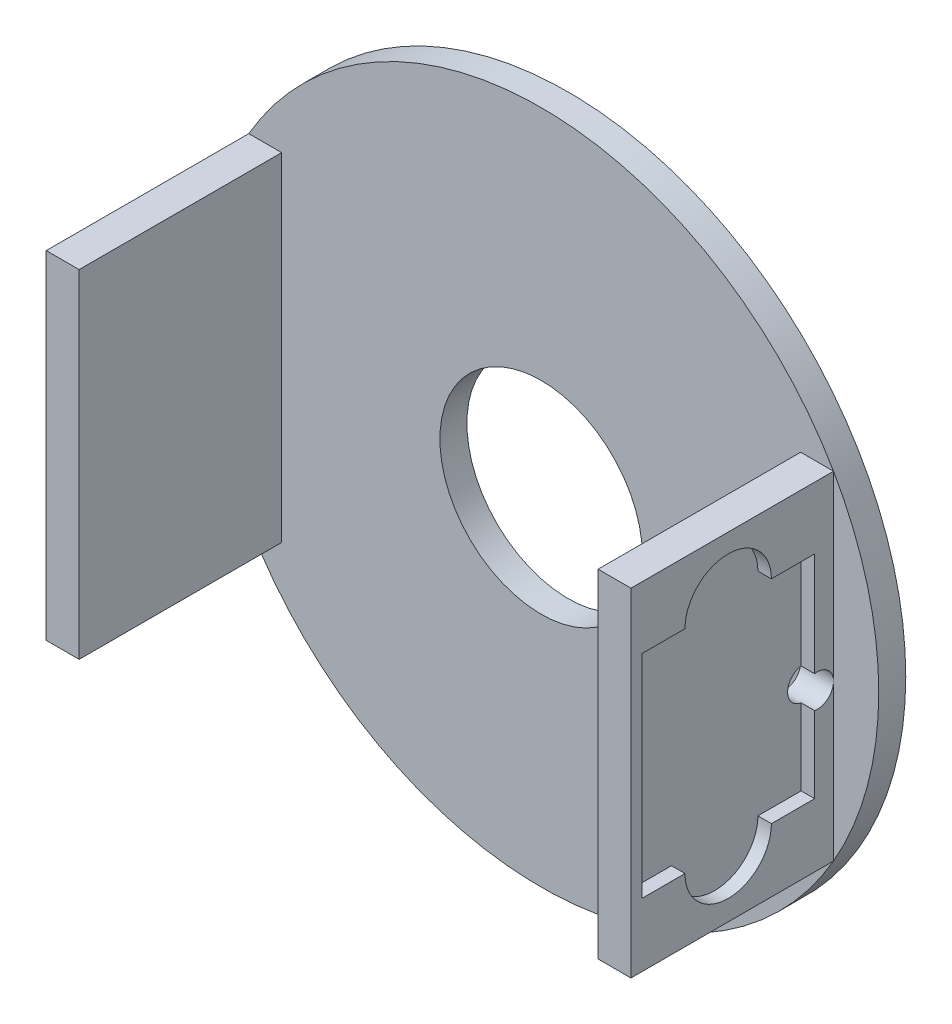
ISO-10303-21;
HEADER;
FILE_DESCRIPTION(('STEP AP214'),'2;1');
FILE_NAME('part.step','',(''),(''),'','','');
FILE_SCHEMA(('AUTOMOTIVE_DESIGN { 1 0 10303 214 1 1 1 1 }'));
ENDSEC;
DATA;
#1=APPLICATION_CONTEXT('core data for automotive mechanical design processes');
#2=APPLICATION_PROTOCOL_DEFINITION('international standard','automotive_design',2000,#1);
#3=PRODUCT_CONTEXT('',#1,'mechanical');
#4=PRODUCT('Part','Part','',(#3));
#5=PRODUCT_RELATED_PRODUCT_CATEGORY('part','',(#4));
#6=PRODUCT_DEFINITION_FORMATION('','',#4);
#7=PRODUCT_DEFINITION_CONTEXT('part definition',#1,'design');
#8=PRODUCT_DEFINITION('design','',#6,#7);
#9=PRODUCT_DEFINITION_SHAPE('','',#8);
#10=(LENGTH_UNIT() NAMED_UNIT(*) SI_UNIT(.MILLI.,.METRE.));
#11=(NAMED_UNIT(*) PLANE_ANGLE_UNIT() SI_UNIT($,.RADIAN.));
#12=(NAMED_UNIT(*) SI_UNIT($,.STERADIAN.) SOLID_ANGLE_UNIT());
#13=UNCERTAINTY_MEASURE_WITH_UNIT(LENGTH_MEASURE(1.E-05),#10,'distance_accuracy_value','');
#14=(GEOMETRIC_REPRESENTATION_CONTEXT(3) GLOBAL_UNCERTAINTY_ASSIGNED_CONTEXT((#13)) GLOBAL_UNIT_ASSIGNED_CONTEXT((#10,
#11,#12)) REPRESENTATION_CONTEXT('',''));
#15=CARTESIAN_POINT('',(0.,0.,0.));
#16=DIRECTION('',(0.,0.,1.));
#17=DIRECTION('',(1.,0.,0.));
#18=AXIS2_PLACEMENT_3D('',#15,#16,#17);
#19=CARTESIAN_POINT('',(20.650635094611,-7.8,3.4));
#20=DIRECTION('',(0.,0.,-1.));
#21=DIRECTION('',(-1.,0.,0.));
#22=AXIS2_PLACEMENT_3D('',#19,#20,#21);
#23=PLANE('',#22);
#24=DIRECTION('',(0.,1.,0.));
#25=VECTOR('',#24,1.);
#26=CARTESIAN_POINT('',(20.650635094611,-7.8,3.4));
#27=LINE('',#26,#25);
#28=CARTESIAN_POINT('',(20.650635094611,0.214707983327035,3.4));
#29=VERTEX_POINT('',#28);
#30=CARTESIAN_POINT('',(20.650635094611,7.90000000000001,3.4));
#31=VERTEX_POINT('',#30);
#32=EDGE_CURVE('E405',#29,#31,#27,.T.);
#33=ORIENTED_EDGE('',*,*,#32,.F.);
#34=DIRECTION('',(1.,0.,0.));
#35=VECTOR('',#34,1.);
#36=CARTESIAN_POINT('',(12.650635094611,0.214707983327035,3.4));
#37=LINE('',#36,#35);
#38=CARTESIAN_POINT('',(21.650635094611,0.214707983327035,3.4));
#39=VERTEX_POINT('',#38);
#40=EDGE_CURVE('E58',#29,#39,#37,.T.);
#41=ORIENTED_EDGE('',*,*,#40,.T.);
#42=DIRECTION('',(0.,1.,0.));
#43=VECTOR('',#42,1.);
#44=CARTESIAN_POINT('',(21.650635094611,-7.8,3.4));
#45=LINE('',#44,#43);
#46=CARTESIAN_POINT('',(21.650635094611,7.90000000000001,3.4));
#47=VERTEX_POINT('',#46);
#48=EDGE_CURVE('E184',#39,#47,#45,.T.);
#49=ORIENTED_EDGE('',*,*,#48,.T.);
#50=DIRECTION('',(1.,0.,0.));
#51=VECTOR('',#50,1.);
#52=CARTESIAN_POINT('',(20.650635094611,7.90000000000001,3.4));
#53=LINE('',#52,#51);
#54=EDGE_CURVE('E364',#31,#47,#53,.T.);
#55=ORIENTED_EDGE('',*,*,#54,.F.);
#56=EDGE_LOOP('',(#33,#41,#49,#55));
#57=FACE_BOUND('',#56,.T.);
#58=ADVANCED_FACE('F39',(#57),#23,.F.);
#59=CARTESIAN_POINT('',(0.,0.,2.));
#60=DIRECTION('',(0.,0.,1.));
#61=DIRECTION('',(1.,0.,0.));
#62=AXIS2_PLACEMENT_3D('',#59,#60,#61);
#63=PLANE('',#62);
#64=CARTESIAN_POINT('',(0.,0.,2.));
#65=DIRECTION('',(0.,0.,1.));
#66=DIRECTION('',(1.,0.,0.));
#67=AXIS2_PLACEMENT_3D('',#64,#65,#66);
#68=CIRCLE('',#67,25.);
#69=CARTESIAN_POINT('',(21.650635094611,-12.5,2.));
#70=VERTEX_POINT('',#69);
#71=CARTESIAN_POINT('',(21.650635094611,12.5,2.));
#72=VERTEX_POINT('',#71);
#73=EDGE_CURVE('E191',#70,#72,#68,.T.);
#74=ORIENTED_EDGE('',*,*,#73,.T.);
#75=DIRECTION('',(0.,1.,0.));
#76=VECTOR('',#75,1.);
#77=CARTESIAN_POINT('',(21.650635094611,12.5,2.));
#78=LINE('',#77,#76);
#79=CARTESIAN_POINT('',(21.650635094611,-0.968507973292888,2.));
#80=VERTEX_POINT('',#79);
#81=EDGE_CURVE('E181',#80,#72,#78,.T.);
#82=ORIENTED_EDGE('',*,*,#81,.F.);
#83=EDGE_CURVE('E189',#70,#80,#78,.T.);
#84=ORIENTED_EDGE('',*,*,#83,.F.);
#85=EDGE_LOOP('',(#74,#82,#84));
#86=FACE_BOUND('',#85,.T.);
#87=ADVANCED_FACE('F188',(#86),#63,.T.);
#88=DIRECTION('',(0.,-1.,0.));
#89=VECTOR('',#88,1.);
#90=CARTESIAN_POINT('',(19.2145374922252,12.5,2.));
#91=LINE('',#90,#89);
#92=CARTESIAN_POINT('',(19.2145374922252,-0.968507973292888,2.));
#93=VERTEX_POINT('',#92);
#94=CARTESIAN_POINT('',(19.2145374922252,-12.5,2.));
#95=VERTEX_POINT('',#94);
#96=EDGE_CURVE('E199',#93,#95,#91,.T.);
#97=ORIENTED_EDGE('',*,*,#96,.F.);
#98=CARTESIAN_POINT('',(19.2145374922252,12.5,2.));
#99=VERTEX_POINT('',#98);
#100=EDGE_CURVE('E205',#99,#93,#91,.T.);
#101=ORIENTED_EDGE('',*,*,#100,.F.);
#102=DIRECTION('',(-1.,0.,0.));
#103=VECTOR('',#102,1.);
#104=CARTESIAN_POINT('',(21.650635094611,12.5,2.));
#105=LINE('',#104,#103);
#106=EDGE_CURVE('E198',#72,#99,#105,.T.);
#107=ORIENTED_EDGE('',*,*,#106,.F.);
#108=CARTESIAN_POINT('',(-21.650635094611,12.5,2.));
#109=VERTEX_POINT('',#108);
#110=EDGE_CURVE('E262',#72,#109,#68,.T.);
#111=ORIENTED_EDGE('',*,*,#110,.T.);
#112=DIRECTION('',(1.,0.,0.));
#113=VECTOR('',#112,1.);
#114=CARTESIAN_POINT('',(-21.650635094611,12.5,2.));
#115=LINE('',#114,#113);
#116=CARTESIAN_POINT('',(-19.2145374922252,12.5,2.));
#117=VERTEX_POINT('',#116);
#118=EDGE_CURVE('E225',#109,#117,#115,.T.);
#119=ORIENTED_EDGE('',*,*,#118,.T.);
#120=DIRECTION('',(0.,-1.,0.));
#121=VECTOR('',#120,1.);
#122=CARTESIAN_POINT('',(-19.2145374922252,12.5,2.));
#123=LINE('',#122,#121);
#124=CARTESIAN_POINT('',(-19.2145374922252,-12.5,2.));
#125=VERTEX_POINT('',#124);
#126=EDGE_CURVE('E239',#117,#125,#123,.T.);
#127=ORIENTED_EDGE('',*,*,#126,.T.);
#128=DIRECTION('',(1.,0.,0.));
#129=VECTOR('',#128,1.);
#130=CARTESIAN_POINT('',(-21.650635094611,-12.5,2.));
#131=LINE('',#130,#129);
#132=CARTESIAN_POINT('',(-21.650635094611,-12.5,2.));
#133=VERTEX_POINT('',#132);
#134=EDGE_CURVE('E236',#133,#125,#131,.T.);
#135=ORIENTED_EDGE('',*,*,#134,.F.);
#136=EDGE_CURVE('E261',#133,#70,#68,.T.);
#137=ORIENTED_EDGE('',*,*,#136,.T.);
#138=DIRECTION('',(1.,0.,0.));
#139=VECTOR('',#138,1.);
#140=CARTESIAN_POINT('',(21.650635094611,-12.5,2.));
#141=LINE('',#140,#139);
#142=EDGE_CURVE('E208',#95,#70,#141,.T.);
#143=ORIENTED_EDGE('',*,*,#142,.F.);
#144=EDGE_LOOP('',(#97,#101,#107,#111,#119,#127,#135,#137,#143));
#145=FACE_BOUND('',#144,.T.);
#146=CARTESIAN_POINT('',(0.,0.,2.));
#147=DIRECTION('',(0.,0.,1.));
#148=DIRECTION('',(1.,0.,0.));
#149=AXIS2_PLACEMENT_3D('',#146,#147,#148);
#150=CIRCLE('',#149,7.5);
#151=CARTESIAN_POINT('',(7.5,0.,2.));
#152=VERTEX_POINT('',#151);
#153=EDGE_CURVE('E254',#152,#152,#150,.T.);
#154=ORIENTED_EDGE('',*,*,#153,.F.);
#155=EDGE_LOOP('',(#154));
#156=FACE_BOUND('',#155,.T.);
#157=ADVANCED_FACE('F274',(#145,#156),#63,.T.);
#158=DIRECTION('',(0.,-1.,0.));
#159=VECTOR('',#158,1.);
#160=CARTESIAN_POINT('',(-21.650635094611,12.5,2.));
#161=LINE('',#160,#159);
#162=EDGE_CURVE('E220',#109,#133,#161,.T.);
#163=ORIENTED_EDGE('',*,*,#162,.F.);
#164=EDGE_CURVE('E47',#109,#133,#68,.T.);
#165=ORIENTED_EDGE('',*,*,#164,.T.);
#166=EDGE_LOOP('',(#163,#165));
#167=FACE_BOUND('',#166,.T.);
#168=ADVANCED_FACE('F279',(#167),#63,.T.);
#169=CARTESIAN_POINT('',(0.,0.,0.));
#170=DIRECTION('',(0.,0.,1.));
#171=DIRECTION('',(1.,0.,0.));
#172=AXIS2_PLACEMENT_3D('',#169,#170,#171);
#173=PLANE('',#172);
#174=CARTESIAN_POINT('',(0.,0.,0.));
#175=DIRECTION('',(0.,0.,1.));
#176=DIRECTION('',(1.,0.,0.));
#177=AXIS2_PLACEMENT_3D('',#174,#175,#176);
#178=CIRCLE('',#177,25.);
#179=CARTESIAN_POINT('',(25.,0.,0.));
#180=VERTEX_POINT('',#179);
#181=EDGE_CURVE('E257',#180,#180,#178,.T.);
#182=ORIENTED_EDGE('',*,*,#181,.F.);
#183=EDGE_LOOP('',(#182));
#184=FACE_BOUND('',#183,.T.);
#185=CARTESIAN_POINT('',(0.,0.,0.));
#186=DIRECTION('',(0.,0.,1.));
#187=DIRECTION('',(1.,0.,0.));
#188=AXIS2_PLACEMENT_3D('',#185,#186,#187);
#189=CIRCLE('',#188,7.5);
#190=CARTESIAN_POINT('',(7.5,0.,0.));
#191=VERTEX_POINT('',#190);
#192=EDGE_CURVE('E253',#191,#191,#189,.T.);
#193=ORIENTED_EDGE('',*,*,#192,.T.);
#194=EDGE_LOOP('',(#193));
#195=FACE_BOUND('',#194,.T.);
#196=ADVANCED_FACE('F617',(#184,#195),#173,.F.);
#197=CARTESIAN_POINT('',(0.,0.,2.));
#198=DIRECTION('',(0.,0.,-1.));
#199=DIRECTION('',(-1.,0.,0.));
#200=AXIS2_PLACEMENT_3D('',#197,#198,#199);
#201=CYLINDRICAL_SURFACE('',#200,25.);
#202=ORIENTED_EDGE('',*,*,#164,.F.);
#203=ORIENTED_EDGE('',*,*,#110,.F.);
#204=ORIENTED_EDGE('',*,*,#73,.F.);
#205=ORIENTED_EDGE('',*,*,#136,.F.);
#206=EDGE_LOOP('',(#202,#203,#204,#205));
#207=FACE_BOUND('',#206,.T.);
#208=ORIENTED_EDGE('',*,*,#181,.T.);
#209=EDGE_LOOP('',(#208));
#210=FACE_BOUND('',#209,.T.);
#211=ADVANCED_FACE('F41',(#207,#210),#201,.T.);
#212=CARTESIAN_POINT('',(0.,0.,2.));
#213=DIRECTION('',(0.,0.,-1.));
#214=DIRECTION('',(-1.,0.,0.));
#215=AXIS2_PLACEMENT_3D('',#212,#213,#214);
#216=CYLINDRICAL_SURFACE('',#215,7.5);
#217=ORIENTED_EDGE('',*,*,#153,.T.);
#218=EDGE_LOOP('',(#217));
#219=FACE_BOUND('',#218,.T.);
#220=ORIENTED_EDGE('',*,*,#192,.F.);
#221=EDGE_LOOP('',(#220));
#222=FACE_BOUND('',#221,.T.);
#223=ADVANCED_FACE('F598',(#219,#222),#216,.F.);
#224=CARTESIAN_POINT('',(-21.650635094611,12.5,17.));
#225=DIRECTION('',(1.,0.,0.));
#226=DIRECTION('',(0.,0.,-1.));
#227=AXIS2_PLACEMENT_3D('',#224,#225,#226);
#228=PLANE('',#227);
#229=ORIENTED_EDGE('',*,*,#162,.T.);
#230=DIRECTION('',(0.,0.,-1.));
#231=VECTOR('',#230,1.);
#232=CARTESIAN_POINT('',(-21.650635094611,-12.5,17.));
#233=LINE('',#232,#231);
#234=CARTESIAN_POINT('',(-21.650635094611,-12.5,17.));
#235=VERTEX_POINT('',#234);
#236=EDGE_CURVE('E250',#235,#133,#233,.T.);
#237=ORIENTED_EDGE('',*,*,#236,.F.);
#238=DIRECTION('',(0.,-1.,0.));
#239=VECTOR('',#238,1.);
#240=CARTESIAN_POINT('',(-21.650635094611,12.5,17.));
#241=LINE('',#240,#239);
#242=CARTESIAN_POINT('',(-21.650635094611,12.5,17.));
#243=VERTEX_POINT('',#242);
#244=EDGE_CURVE('E221',#243,#235,#241,.T.);
#245=ORIENTED_EDGE('',*,*,#244,.F.);
#246=DIRECTION('',(0.,0.,-1.));
#247=VECTOR('',#246,1.);
#248=CARTESIAN_POINT('',(-21.650635094611,12.5,17.));
#249=LINE('',#248,#247);
#250=EDGE_CURVE('E233',#243,#109,#249,.T.);
#251=ORIENTED_EDGE('',*,*,#250,.T.);
#252=EDGE_LOOP('',(#229,#237,#245,#251));
#253=FACE_BOUND('',#252,.T.);
#254=ADVANCED_FACE('F286',(#253),#228,.F.);
#255=CARTESIAN_POINT('',(-21.650635094611,-12.5,17.));
#256=DIRECTION('',(0.,1.,0.));
#257=DIRECTION('',(0.,0.,1.));
#258=AXIS2_PLACEMENT_3D('',#255,#256,#257);
#259=PLANE('',#258);
#260=ORIENTED_EDGE('',*,*,#134,.T.);
#261=DIRECTION('',(0.,0.,-1.));
#262=VECTOR('',#261,1.);
#263=CARTESIAN_POINT('',(-19.2145374922252,-12.5,17.));
#264=LINE('',#263,#262);
#265=CARTESIAN_POINT('',(-19.2145374922252,-12.5,17.));
#266=VERTEX_POINT('',#265);
#267=EDGE_CURVE('E247',#266,#125,#264,.T.);
#268=ORIENTED_EDGE('',*,*,#267,.F.);
#269=DIRECTION('',(1.,0.,0.));
#270=VECTOR('',#269,1.);
#271=CARTESIAN_POINT('',(-21.650635094611,-12.5,17.));
#272=LINE('',#271,#270);
#273=EDGE_CURVE('E224',#235,#266,#272,.T.);
#274=ORIENTED_EDGE('',*,*,#273,.F.);
#275=ORIENTED_EDGE('',*,*,#236,.T.);
#276=EDGE_LOOP('',(#260,#268,#274,#275));
#277=FACE_BOUND('',#276,.T.);
#278=ADVANCED_FACE('F282',(#277),#259,.F.);
#279=CARTESIAN_POINT('',(-19.2145374922252,12.5,17.));
#280=DIRECTION('',(1.,0.,0.));
#281=DIRECTION('',(0.,0.,-1.));
#282=AXIS2_PLACEMENT_3D('',#279,#280,#281);
#283=PLANE('',#282);
#284=ORIENTED_EDGE('',*,*,#126,.F.);
#285=DIRECTION('',(0.,0.,-1.));
#286=VECTOR('',#285,1.);
#287=CARTESIAN_POINT('',(-19.2145374922252,12.5,17.));
#288=LINE('',#287,#286);
#289=CARTESIAN_POINT('',(-19.2145374922252,12.5,17.));
#290=VERTEX_POINT('',#289);
#291=EDGE_CURVE('E244',#290,#117,#288,.T.);
#292=ORIENTED_EDGE('',*,*,#291,.F.);
#293=DIRECTION('',(0.,-1.,0.));
#294=VECTOR('',#293,1.);
#295=CARTESIAN_POINT('',(-19.2145374922252,12.5,17.));
#296=LINE('',#295,#294);
#297=EDGE_CURVE('E227',#290,#266,#296,.T.);
#298=ORIENTED_EDGE('',*,*,#297,.T.);
#299=ORIENTED_EDGE('',*,*,#267,.T.);
#300=EDGE_LOOP('',(#284,#292,#298,#299));
#301=FACE_BOUND('',#300,.T.);
#302=ADVANCED_FACE('F293',(#301),#283,.T.);
#303=CARTESIAN_POINT('',(-21.650635094611,12.5,17.));
#304=DIRECTION('',(0.,1.,0.));
#305=DIRECTION('',(0.,0.,1.));
#306=AXIS2_PLACEMENT_3D('',#303,#304,#305);
#307=PLANE('',#306);
#308=ORIENTED_EDGE('',*,*,#118,.F.);
#309=ORIENTED_EDGE('',*,*,#250,.F.);
#310=DIRECTION('',(1.,0.,0.));
#311=VECTOR('',#310,1.);
#312=CARTESIAN_POINT('',(-21.650635094611,12.5,17.));
#313=LINE('',#312,#311);
#314=EDGE_CURVE('E230',#243,#290,#313,.T.);
#315=ORIENTED_EDGE('',*,*,#314,.T.);
#316=ORIENTED_EDGE('',*,*,#291,.T.);
#317=EDGE_LOOP('',(#308,#309,#315,#316));
#318=FACE_BOUND('',#317,.T.);
#319=ADVANCED_FACE('F290',(#318),#307,.T.);
#320=CARTESIAN_POINT('',(0.,0.,17.));
#321=DIRECTION('',(0.,0.,1.));
#322=DIRECTION('',(1.,0.,0.));
#323=AXIS2_PLACEMENT_3D('',#320,#321,#322);
#324=PLANE('',#323);
#325=ORIENTED_EDGE('',*,*,#244,.T.);
#326=ORIENTED_EDGE('',*,*,#273,.T.);
#327=ORIENTED_EDGE('',*,*,#297,.F.);
#328=ORIENTED_EDGE('',*,*,#314,.F.);
#329=EDGE_LOOP('',(#325,#326,#327,#328));
#330=FACE_BOUND('',#329,.T.);
#331=ADVANCED_FACE('F296',(#330),#324,.T.);
#332=CARTESIAN_POINT('',(21.650635094611,12.5,17.));
#333=DIRECTION('',(-1.,0.,0.));
#334=DIRECTION('',(0.,0.,1.));
#335=AXIS2_PLACEMENT_3D('',#332,#333,#334);
#336=PLANE('',#335);
#337=ORIENTED_EDGE('',*,*,#48,.F.);
#338=CARTESIAN_POINT('',(21.650635094611,-0.968507973292888,3.2));
#339=DIRECTION('',(1.,0.,0.));
#340=DIRECTION('',(0.,0.,-1.));
#341=AXIS2_PLACEMENT_3D('',#338,#339,#340);
#342=CIRCLE('',#341,1.2);
#343=EDGE_CURVE('E169',#80,#39,#342,.T.);
#344=ORIENTED_EDGE('',*,*,#343,.F.);
#345=ORIENTED_EDGE('',*,*,#81,.T.);
#346=DIRECTION('',(0.,0.,-1.));
#347=VECTOR('',#346,1.);
#348=CARTESIAN_POINT('',(21.650635094611,12.5,17.));
#349=LINE('',#348,#347);
#350=CARTESIAN_POINT('',(21.650635094611,12.5,17.));
#351=VERTEX_POINT('',#350);
#352=EDGE_CURVE('E218',#351,#72,#349,.T.);
#353=ORIENTED_EDGE('',*,*,#352,.F.);
#354=DIRECTION('',(0.,1.,0.));
#355=VECTOR('',#354,1.);
#356=CARTESIAN_POINT('',(21.650635094611,12.5,17.));
#357=LINE('',#356,#355);
#358=CARTESIAN_POINT('',(21.650635094611,-12.5,17.));
#359=VERTEX_POINT('',#358);
#360=EDGE_CURVE('E210',#359,#351,#357,.T.);
#361=ORIENTED_EDGE('',*,*,#360,.F.);
#362=DIRECTION('',(0.,0.,-1.));
#363=VECTOR('',#362,1.);
#364=CARTESIAN_POINT('',(21.650635094611,-12.5,17.));
#365=LINE('',#364,#363);
#366=EDGE_CURVE('E197',#359,#70,#365,.T.);
#367=ORIENTED_EDGE('',*,*,#366,.T.);
#368=ORIENTED_EDGE('',*,*,#83,.T.);
#369=CARTESIAN_POINT('',(21.650635094611,-2.15172392991281,3.4));
#370=VERTEX_POINT('',#369);
#371=EDGE_CURVE('E166',#370,#80,#342,.T.);
#372=ORIENTED_EDGE('',*,*,#371,.F.);
#373=CARTESIAN_POINT('',(21.650635094611,-7.8,3.4));
#374=VERTEX_POINT('',#373);
#375=EDGE_CURVE('E333',#374,#370,#45,.T.);
#376=ORIENTED_EDGE('',*,*,#375,.F.);
#377=DIRECTION('',(0.,0.,-1.));
#378=VECTOR('',#377,1.);
#379=CARTESIAN_POINT('',(21.650635094611,-7.8,6.6));
#380=LINE('',#379,#378);
#381=CARTESIAN_POINT('',(21.650635094611,-7.8,6.6));
#382=VERTEX_POINT('',#381);
#383=EDGE_CURVE('E344',#382,#374,#380,.T.);
#384=ORIENTED_EDGE('',*,*,#383,.F.);
#385=CARTESIAN_POINT('',(21.650635094611,-7.8,9.8));
#386=DIRECTION('',(1.,0.,0.));
#387=DIRECTION('',(0.,0.,-1.));
#388=AXIS2_PLACEMENT_3D('',#385,#386,#387);
#389=CIRCLE('',#388,3.2);
#390=CARTESIAN_POINT('',(21.650635094611,-7.8,13.));
#391=VERTEX_POINT('',#390);
#392=EDGE_CURVE('E392',#391,#382,#389,.T.);
#393=ORIENTED_EDGE('',*,*,#392,.F.);
#394=DIRECTION('',(0.,0.,-1.));
#395=VECTOR('',#394,1.);
#396=CARTESIAN_POINT('',(21.650635094611,-7.8,16.2));
#397=LINE('',#396,#395);
#398=CARTESIAN_POINT('',(21.650635094611,-7.8,16.2));
#399=VERTEX_POINT('',#398);
#400=EDGE_CURVE('E390',#399,#391,#397,.T.);
#401=ORIENTED_EDGE('',*,*,#400,.F.);
#402=DIRECTION('',(0.,-1.,0.));
#403=VECTOR('',#402,1.);
#404=CARTESIAN_POINT('',(21.650635094611,-7.8,16.2));
#405=LINE('',#404,#403);
#406=CARTESIAN_POINT('',(21.650635094611,7.9,16.2));
#407=VERTEX_POINT('',#406);
#408=EDGE_CURVE('E353',#407,#399,#405,.T.);
#409=ORIENTED_EDGE('',*,*,#408,.F.);
#410=DIRECTION('',(0.,0.,1.));
#411=VECTOR('',#410,1.);
#412=CARTESIAN_POINT('',(21.650635094611,7.9,16.2));
#413=LINE('',#412,#411);
#414=CARTESIAN_POINT('',(21.650635094611,7.9,13.));
#415=VERTEX_POINT('',#414);
#416=EDGE_CURVE('E350',#415,#407,#413,.T.);
#417=ORIENTED_EDGE('',*,*,#416,.F.);
#418=CARTESIAN_POINT('',(21.650635094611,7.9,9.8));
#419=DIRECTION('',(1.,0.,0.));
#420=DIRECTION('',(0.,0.,-1.));
#421=AXIS2_PLACEMENT_3D('',#418,#419,#420);
#422=CIRCLE('',#421,3.2);
#423=CARTESIAN_POINT('',(21.650635094611,7.9,6.6));
#424=VERTEX_POINT('',#423);
#425=EDGE_CURVE('E342',#424,#415,#422,.T.);
#426=ORIENTED_EDGE('',*,*,#425,.F.);
#427=DIRECTION('',(0.,0.,1.));
#428=VECTOR('',#427,1.);
#429=CARTESIAN_POINT('',(21.650635094611,7.9,6.6));
#430=LINE('',#429,#428);
#431=EDGE_CURVE('E339',#47,#424,#430,.T.);
#432=ORIENTED_EDGE('',*,*,#431,.F.);
#433=EDGE_LOOP('',(#337,#344,#345,#353,#361,#367,#368,#372,#376,#384,#393,#401,#409,#417,#426,#432));
#434=FACE_BOUND('',#433,.T.);
#435=ADVANCED_FACE('F179',(#434),#336,.F.);
#436=CARTESIAN_POINT('',(21.650635094611,12.5,17.));
#437=DIRECTION('',(0.,-1.,0.));
#438=DIRECTION('',(0.,0.,-1.));
#439=AXIS2_PLACEMENT_3D('',#436,#437,#438);
#440=PLANE('',#439);
#441=ORIENTED_EDGE('',*,*,#106,.T.);
#442=DIRECTION('',(0.,0.,-1.));
#443=VECTOR('',#442,1.);
#444=CARTESIAN_POINT('',(19.2145374922252,12.5,17.));
#445=LINE('',#444,#443);
#446=CARTESIAN_POINT('',(19.2145374922252,12.5,17.));
#447=VERTEX_POINT('',#446);
#448=EDGE_CURVE('E215',#447,#99,#445,.T.);
#449=ORIENTED_EDGE('',*,*,#448,.F.);
#450=DIRECTION('',(-1.,0.,0.));
#451=VECTOR('',#450,1.);
#452=CARTESIAN_POINT('',(21.650635094611,12.5,17.));
#453=LINE('',#452,#451);
#454=EDGE_CURVE('E376',#351,#447,#453,.T.);
#455=ORIENTED_EDGE('',*,*,#454,.F.);
#456=ORIENTED_EDGE('',*,*,#352,.T.);
#457=EDGE_LOOP('',(#441,#449,#455,#456));
#458=FACE_BOUND('',#457,.T.);
#459=ADVANCED_FACE('F304',(#458),#440,.F.);
#460=CARTESIAN_POINT('',(19.2145374922252,12.5,17.));
#461=DIRECTION('',(1.,0.,0.));
#462=DIRECTION('',(0.,0.,-1.));
#463=AXIS2_PLACEMENT_3D('',#460,#461,#462);
#464=PLANE('',#463);
#465=ORIENTED_EDGE('',*,*,#100,.T.);
#466=CARTESIAN_POINT('',(19.2145374922252,-0.968507973292888,3.2));
#467=DIRECTION('',(1.,0.,0.));
#468=DIRECTION('',(0.,0.,-1.));
#469=AXIS2_PLACEMENT_3D('',#466,#467,#468);
#470=CIRCLE('',#469,1.2);
#471=EDGE_CURVE('E52',#93,#93,#470,.T.);
#472=ORIENTED_EDGE('',*,*,#471,.T.);
#473=ORIENTED_EDGE('',*,*,#96,.T.);
#474=DIRECTION('',(0.,0.,-1.));
#475=VECTOR('',#474,1.);
#476=CARTESIAN_POINT('',(19.2145374922252,-12.5,17.));
#477=LINE('',#476,#475);
#478=CARTESIAN_POINT('',(19.2145374922252,-12.5,17.));
#479=VERTEX_POINT('',#478);
#480=EDGE_CURVE('E212',#479,#95,#477,.T.);
#481=ORIENTED_EDGE('',*,*,#480,.F.);
#482=DIRECTION('',(0.,-1.,0.));
#483=VECTOR('',#482,1.);
#484=CARTESIAN_POINT('',(19.2145374922252,12.5,17.));
#485=LINE('',#484,#483);
#486=EDGE_CURVE('E377',#447,#479,#485,.T.);
#487=ORIENTED_EDGE('',*,*,#486,.F.);
#488=ORIENTED_EDGE('',*,*,#448,.T.);
#489=EDGE_LOOP('',(#465,#472,#473,#481,#487,#488));
#490=FACE_BOUND('',#489,.T.);
#491=ADVANCED_FACE('F389',(#490),#464,.F.);
#492=CARTESIAN_POINT('',(21.650635094611,-12.5,17.));
#493=DIRECTION('',(0.,1.,0.));
#494=DIRECTION('',(0.,0.,1.));
#495=AXIS2_PLACEMENT_3D('',#492,#493,#494);
#496=PLANE('',#495);
#497=ORIENTED_EDGE('',*,*,#142,.T.);
#498=ORIENTED_EDGE('',*,*,#366,.F.);
#499=DIRECTION('',(1.,0.,0.));
#500=VECTOR('',#499,1.);
#501=CARTESIAN_POINT('',(21.650635094611,-12.5,17.));
#502=LINE('',#501,#500);
#503=EDGE_CURVE('E202',#479,#359,#502,.T.);
#504=ORIENTED_EDGE('',*,*,#503,.F.);
#505=ORIENTED_EDGE('',*,*,#480,.T.);
#506=EDGE_LOOP('',(#497,#498,#504,#505));
#507=FACE_BOUND('',#506,.T.);
#508=ADVANCED_FACE('F384',(#507),#496,.F.);
#509=CARTESIAN_POINT('',(0.,0.,17.));
#510=DIRECTION('',(0.,0.,-1.));
#511=DIRECTION('',(-1.,0.,0.));
#512=AXIS2_PLACEMENT_3D('',#509,#510,#511);
#513=PLANE('',#512);
#514=ORIENTED_EDGE('',*,*,#360,.T.);
#515=ORIENTED_EDGE('',*,*,#454,.T.);
#516=ORIENTED_EDGE('',*,*,#486,.T.);
#517=ORIENTED_EDGE('',*,*,#503,.T.);
#518=EDGE_LOOP('',(#514,#515,#516,#517));
#519=FACE_BOUND('',#518,.T.);
#520=ADVANCED_FACE('F382',(#519),#513,.F.);
#521=CARTESIAN_POINT('',(20.650635094611,-7.8,16.2));
#522=DIRECTION('',(0.,-1.,0.));
#523=DIRECTION('',(0.,0.,-1.));
#524=AXIS2_PLACEMENT_3D('',#521,#522,#523);
#525=PLANE('',#524);
#526=ORIENTED_EDGE('',*,*,#400,.T.);
#527=DIRECTION('',(1.,0.,0.));
#528=VECTOR('',#527,1.);
#529=CARTESIAN_POINT('',(20.650635094611,-7.8,13.));
#530=LINE('',#529,#528);
#531=CARTESIAN_POINT('',(20.650635094611,-7.8,13.));
#532=VERTEX_POINT('',#531);
#533=EDGE_CURVE('E370',#532,#391,#530,.T.);
#534=ORIENTED_EDGE('',*,*,#533,.F.);
#535=DIRECTION('',(0.,0.,-1.));
#536=VECTOR('',#535,1.);
#537=CARTESIAN_POINT('',(20.650635094611,-7.8,16.2));
#538=LINE('',#537,#536);
#539=CARTESIAN_POINT('',(20.650635094611,-7.8,16.2));
#540=VERTEX_POINT('',#539);
#541=EDGE_CURVE('E356',#540,#532,#538,.T.);
#542=ORIENTED_EDGE('',*,*,#541,.F.);
#543=DIRECTION('',(1.,0.,0.));
#544=VECTOR('',#543,1.);
#545=CARTESIAN_POINT('',(20.650635094611,-7.8,16.2));
#546=LINE('',#545,#544);
#547=EDGE_CURVE('E192',#540,#399,#546,.T.);
#548=ORIENTED_EDGE('',*,*,#547,.T.);
#549=EDGE_LOOP('',(#526,#534,#542,#548));
#550=FACE_BOUND('',#549,.T.);
#551=ADVANCED_FACE('F426',(#550),#525,.F.);
#552=CARTESIAN_POINT('',(20.650635094611,-7.8,16.2));
#553=DIRECTION('',(0.,0.,1.));
#554=DIRECTION('',(1.,0.,0.));
#555=AXIS2_PLACEMENT_3D('',#552,#553,#554);
#556=PLANE('',#555);
#557=ORIENTED_EDGE('',*,*,#408,.T.);
#558=ORIENTED_EDGE('',*,*,#547,.F.);
#559=DIRECTION('',(0.,-1.,0.));
#560=VECTOR('',#559,1.);
#561=CARTESIAN_POINT('',(20.650635094611,-7.8,16.2));
#562=LINE('',#561,#560);
#563=CARTESIAN_POINT('',(20.650635094611,7.9,16.2));
#564=VERTEX_POINT('',#563);
#565=EDGE_CURVE('E373',#564,#540,#562,.T.);
#566=ORIENTED_EDGE('',*,*,#565,.F.);
#567=DIRECTION('',(1.,0.,0.));
#568=VECTOR('',#567,1.);
#569=CARTESIAN_POINT('',(20.650635094611,7.9,16.2));
#570=LINE('',#569,#568);
#571=EDGE_CURVE('E358',#564,#407,#570,.T.);
#572=ORIENTED_EDGE('',*,*,#571,.T.);
#573=EDGE_LOOP('',(#557,#558,#566,#572));
#574=FACE_BOUND('',#573,.T.);
#575=ADVANCED_FACE('F434',(#574),#556,.F.);
#576=CARTESIAN_POINT('',(20.650635094611,7.9,16.2));
#577=DIRECTION('',(0.,1.,0.));
#578=DIRECTION('',(0.,0.,1.));
#579=AXIS2_PLACEMENT_3D('',#576,#577,#578);
#580=PLANE('',#579);
#581=ORIENTED_EDGE('',*,*,#416,.T.);
#582=ORIENTED_EDGE('',*,*,#571,.F.);
#583=DIRECTION('',(0.,0.,1.));
#584=VECTOR('',#583,1.);
#585=CARTESIAN_POINT('',(20.650635094611,7.9,16.2));
#586=LINE('',#585,#584);
#587=CARTESIAN_POINT('',(20.650635094611,7.9,13.));
#588=VERTEX_POINT('',#587);
#589=EDGE_CURVE('E414',#588,#564,#586,.T.);
#590=ORIENTED_EDGE('',*,*,#589,.F.);
#591=DIRECTION('',(1.,0.,0.));
#592=VECTOR('',#591,1.);
#593=CARTESIAN_POINT('',(20.650635094611,7.9,13.));
#594=LINE('',#593,#592);
#595=EDGE_CURVE('E360',#588,#415,#594,.T.);
#596=ORIENTED_EDGE('',*,*,#595,.T.);
#597=EDGE_LOOP('',(#581,#582,#590,#596));
#598=FACE_BOUND('',#597,.T.);
#599=ADVANCED_FACE('F436',(#598),#580,.F.);
#600=CARTESIAN_POINT('',(20.650635094611,7.9,9.8));
#601=DIRECTION('',(1.,0.,0.));
#602=DIRECTION('',(0.,0.,-1.));
#603=AXIS2_PLACEMENT_3D('',#600,#601,#602);
#604=CYLINDRICAL_SURFACE('',#603,3.2);
#605=ORIENTED_EDGE('',*,*,#425,.T.);
#606=ORIENTED_EDGE('',*,*,#595,.F.);
#607=CARTESIAN_POINT('',(20.650635094611,7.9,9.8));
#608=DIRECTION('',(1.,0.,0.));
#609=DIRECTION('',(0.,0.,-1.));
#610=AXIS2_PLACEMENT_3D('',#607,#608,#609);
#611=CIRCLE('',#610,3.2);
#612=CARTESIAN_POINT('',(20.650635094611,7.9,6.6));
#613=VERTEX_POINT('',#612);
#614=EDGE_CURVE('E411',#613,#588,#611,.T.);
#615=ORIENTED_EDGE('',*,*,#614,.F.);
#616=DIRECTION('',(1.,0.,0.));
#617=VECTOR('',#616,1.);
#618=CARTESIAN_POINT('',(20.650635094611,7.9,6.6));
#619=LINE('',#618,#617);
#620=EDGE_CURVE('E362',#613,#424,#619,.T.);
#621=ORIENTED_EDGE('',*,*,#620,.T.);
#622=EDGE_LOOP('',(#605,#606,#615,#621));
#623=FACE_BOUND('',#622,.T.);
#624=ADVANCED_FACE('F331',(#623),#604,.F.);
#625=CARTESIAN_POINT('',(20.650635094611,7.9,6.6));
#626=DIRECTION('',(0.,1.,0.));
#627=DIRECTION('',(0.,0.,1.));
#628=AXIS2_PLACEMENT_3D('',#625,#626,#627);
#629=PLANE('',#628);
#630=ORIENTED_EDGE('',*,*,#431,.T.);
#631=ORIENTED_EDGE('',*,*,#620,.F.);
#632=DIRECTION('',(0.,0.,1.));
#633=VECTOR('',#632,1.);
#634=CARTESIAN_POINT('',(20.650635094611,7.9,6.6));
#635=LINE('',#634,#633);
#636=EDGE_CURVE('E408',#31,#613,#635,.T.);
#637=ORIENTED_EDGE('',*,*,#636,.F.);
#638=ORIENTED_EDGE('',*,*,#54,.T.);
#639=EDGE_LOOP('',(#630,#631,#637,#638));
#640=FACE_BOUND('',#639,.T.);
#641=ADVANCED_FACE('F321',(#640),#629,.F.);
#642=ORIENTED_EDGE('',*,*,#375,.T.);
#643=DIRECTION('',(1.,0.,0.));
#644=VECTOR('',#643,1.);
#645=CARTESIAN_POINT('',(12.650635094611,-2.15172392991281,3.4));
#646=LINE('',#645,#644);
#647=CARTESIAN_POINT('',(20.650635094611,-2.15172392991281,3.4));
#648=VERTEX_POINT('',#647);
#649=EDGE_CURVE('E171',#370,#648,#646,.F.);
#650=ORIENTED_EDGE('',*,*,#649,.T.);
#651=CARTESIAN_POINT('',(20.650635094611,-7.8,3.4));
#652=VERTEX_POINT('',#651);
#653=EDGE_CURVE('E406',#652,#648,#27,.T.);
#654=ORIENTED_EDGE('',*,*,#653,.F.);
#655=DIRECTION('',(1.,0.,0.));
#656=VECTOR('',#655,1.);
#657=CARTESIAN_POINT('',(20.650635094611,-7.8,3.4));
#658=LINE('',#657,#656);
#659=EDGE_CURVE('E336',#652,#374,#658,.T.);
#660=ORIENTED_EDGE('',*,*,#659,.T.);
#661=EDGE_LOOP('',(#642,#650,#654,#660));
#662=FACE_BOUND('',#661,.T.);
#663=ADVANCED_FACE('F310',(#662),#23,.F.);
#664=CARTESIAN_POINT('',(20.650635094611,-7.8,6.6));
#665=DIRECTION('',(0.,-1.,0.));
#666=DIRECTION('',(0.,0.,-1.));
#667=AXIS2_PLACEMENT_3D('',#664,#665,#666);
#668=PLANE('',#667);
#669=ORIENTED_EDGE('',*,*,#383,.T.);
#670=ORIENTED_EDGE('',*,*,#659,.F.);
#671=DIRECTION('',(0.,0.,-1.));
#672=VECTOR('',#671,1.);
#673=CARTESIAN_POINT('',(20.650635094611,-7.8,6.6));
#674=LINE('',#673,#672);
#675=CARTESIAN_POINT('',(20.650635094611,-7.8,6.6));
#676=VERTEX_POINT('',#675);
#677=EDGE_CURVE('E402',#676,#652,#674,.T.);
#678=ORIENTED_EDGE('',*,*,#677,.F.);
#679=DIRECTION('',(1.,0.,0.));
#680=VECTOR('',#679,1.);
#681=CARTESIAN_POINT('',(20.650635094611,-7.8,6.6));
#682=LINE('',#681,#680);
#683=EDGE_CURVE('E368',#676,#382,#682,.T.);
#684=ORIENTED_EDGE('',*,*,#683,.T.);
#685=EDGE_LOOP('',(#669,#670,#678,#684));
#686=FACE_BOUND('',#685,.T.);
#687=ADVANCED_FACE('F320',(#686),#668,.F.);
#688=CARTESIAN_POINT('',(20.650635094611,-7.8,9.8));
#689=DIRECTION('',(1.,0.,0.));
#690=DIRECTION('',(0.,0.,-1.));
#691=AXIS2_PLACEMENT_3D('',#688,#689,#690);
#692=CYLINDRICAL_SURFACE('',#691,3.2);
#693=ORIENTED_EDGE('',*,*,#392,.T.);
#694=ORIENTED_EDGE('',*,*,#683,.F.);
#695=CARTESIAN_POINT('',(20.650635094611,-7.8,9.8));
#696=DIRECTION('',(1.,0.,0.));
#697=DIRECTION('',(0.,0.,-1.));
#698=AXIS2_PLACEMENT_3D('',#695,#696,#697);
#699=CIRCLE('',#698,3.2);
#700=EDGE_CURVE('E399',#532,#676,#699,.T.);
#701=ORIENTED_EDGE('',*,*,#700,.F.);
#702=ORIENTED_EDGE('',*,*,#533,.T.);
#703=EDGE_LOOP('',(#693,#694,#701,#702));
#704=FACE_BOUND('',#703,.T.);
#705=ADVANCED_FACE('F328',(#704),#692,.F.);
#706=CARTESIAN_POINT('',(20.650635094611,-7.8,9.8));
#707=DIRECTION('',(1.,0.,0.));
#708=DIRECTION('',(0.,0.,-1.));
#709=AXIS2_PLACEMENT_3D('',#706,#707,#708);
#710=PLANE('',#709);
#711=CARTESIAN_POINT('',(20.650635094611,-0.968507973292888,3.2));
#712=DIRECTION('',(1.,0.,0.));
#713=DIRECTION('',(0.,0.,-1.));
#714=AXIS2_PLACEMENT_3D('',#711,#712,#713);
#715=CIRCLE('',#714,1.2);
#716=EDGE_CURVE('E11',#29,#648,#715,.T.);
#717=ORIENTED_EDGE('',*,*,#716,.F.);
#718=ORIENTED_EDGE('',*,*,#32,.T.);
#719=ORIENTED_EDGE('',*,*,#636,.T.);
#720=ORIENTED_EDGE('',*,*,#614,.T.);
#721=ORIENTED_EDGE('',*,*,#589,.T.);
#722=ORIENTED_EDGE('',*,*,#565,.T.);
#723=ORIENTED_EDGE('',*,*,#541,.T.);
#724=ORIENTED_EDGE('',*,*,#700,.T.);
#725=ORIENTED_EDGE('',*,*,#677,.T.);
#726=ORIENTED_EDGE('',*,*,#653,.T.);
#727=EDGE_LOOP('',(#717,#718,#719,#720,#721,#722,#723,#724,#725,#726));
#728=FACE_BOUND('',#727,.T.);
#729=ADVANCED_FACE('F430',(#728),#710,.T.);
#730=CARTESIAN_POINT('',(12.650635094611,-0.968507973292888,3.2));
#731=DIRECTION('',(1.,0.,0.));
#732=DIRECTION('',(0.,0.,-1.));
#733=AXIS2_PLACEMENT_3D('',#730,#731,#732);
#734=CYLINDRICAL_SURFACE('',#733,1.2);
#735=ORIENTED_EDGE('',*,*,#716,.T.);
#736=ORIENTED_EDGE('',*,*,#649,.F.);
#737=ORIENTED_EDGE('',*,*,#371,.T.);
#738=ORIENTED_EDGE('',*,*,#343,.T.);
#739=ORIENTED_EDGE('',*,*,#40,.F.);
#740=EDGE_LOOP('',(#735,#736,#737,#738,#739));
#741=FACE_BOUND('',#740,.T.);
#742=ORIENTED_EDGE('',*,*,#471,.F.);
#743=EDGE_LOOP('',(#742));
#744=FACE_BOUND('',#743,.T.);
#745=ADVANCED_FACE('F168',(#741,#744),#734,.F.);
#746=CLOSED_SHELL('',(#58,#87,#157,#168,#196,#211,#223,#254,#278,#302,#319,#331,#435,#459,#491,
#508,#520,#551,#575,#599,#624,#641,#663,#687,#705,#729,#745));
#747=MANIFOLD_SOLID_BREP('B2',#746);
#748=ADVANCED_BREP_SHAPE_REPRESENTATION('',(#18,#747),#14);
#749=SHAPE_DEFINITION_REPRESENTATION(#9,#748);
ENDSEC;
END-ISO-10303-21;
